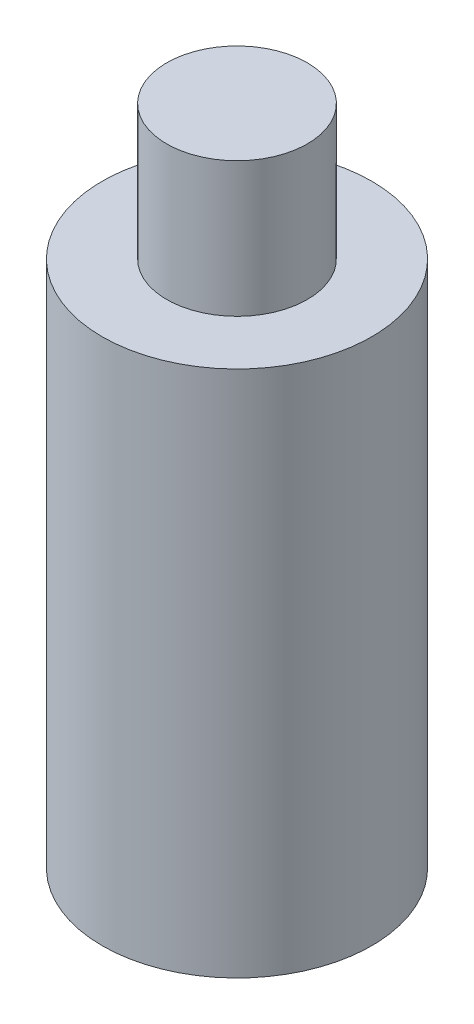
ISO-10303-21;
HEADER;
FILE_DESCRIPTION(('STEP AP214'),'2;1');
FILE_NAME('part.step','',(''),(''),'','','');
FILE_SCHEMA(('AUTOMOTIVE_DESIGN { 1 0 10303 214 1 1 1 1 }'));
ENDSEC;
DATA;
#1=APPLICATION_CONTEXT('core data for automotive mechanical design processes');
#2=APPLICATION_PROTOCOL_DEFINITION('international standard','automotive_design',2000,#1);
#3=PRODUCT_CONTEXT('',#1,'mechanical');
#4=PRODUCT('Part','Part','',(#3));
#5=PRODUCT_RELATED_PRODUCT_CATEGORY('part','',(#4));
#6=PRODUCT_DEFINITION_FORMATION('','',#4);
#7=PRODUCT_DEFINITION_CONTEXT('part definition',#1,'design');
#8=PRODUCT_DEFINITION('design','',#6,#7);
#9=PRODUCT_DEFINITION_SHAPE('','',#8);
#10=(LENGTH_UNIT() NAMED_UNIT(*) SI_UNIT(.MILLI.,.METRE.));
#11=(NAMED_UNIT(*) PLANE_ANGLE_UNIT() SI_UNIT($,.RADIAN.));
#12=(NAMED_UNIT(*) SI_UNIT($,.STERADIAN.) SOLID_ANGLE_UNIT());
#13=UNCERTAINTY_MEASURE_WITH_UNIT(LENGTH_MEASURE(1.E-05),#10,'distance_accuracy_value','');
#14=(GEOMETRIC_REPRESENTATION_CONTEXT(3) GLOBAL_UNCERTAINTY_ASSIGNED_CONTEXT((#13)) GLOBAL_UNIT_ASSIGNED_CONTEXT((#10,
#11,#12)) REPRESENTATION_CONTEXT('',''));
#15=CARTESIAN_POINT('',(0.,0.,0.));
#16=DIRECTION('',(0.,0.,1.));
#17=DIRECTION('',(1.,0.,0.));
#18=AXIS2_PLACEMENT_3D('',#15,#16,#17);
#19=CARTESIAN_POINT('',(0.,29.8196,0.));
#20=DIRECTION('',(0.,-1.,0.));
#21=DIRECTION('',(0.,0.,-1.));
#22=AXIS2_PLACEMENT_3D('',#19,#20,#21);
#23=CYLINDRICAL_SURFACE('',#22,7.62);
#24=CARTESIAN_POINT('',(0.,29.8196,0.));
#25=DIRECTION('',(0.,1.,0.));
#26=DIRECTION('',(0.,0.,1.));
#27=AXIS2_PLACEMENT_3D('',#24,#25,#26);
#28=CIRCLE('',#27,7.62);
#29=CARTESIAN_POINT('',(0.,29.8196,7.62));
#30=VERTEX_POINT('',#29);
#31=EDGE_CURVE('E51',#30,#30,#28,.T.);
#32=ORIENTED_EDGE('',*,*,#31,.F.);
#33=EDGE_LOOP('',(#32));
#34=FACE_BOUND('',#33,.T.);
#35=CARTESIAN_POINT('',(0.,0.,0.));
#36=DIRECTION('',(0.,1.,0.));
#37=DIRECTION('',(0.,0.,1.));
#38=AXIS2_PLACEMENT_3D('',#35,#36,#37);
#39=CIRCLE('',#38,7.62);
#40=CARTESIAN_POINT('',(0.,0.,7.62));
#41=VERTEX_POINT('',#40);
#42=EDGE_CURVE('E46',#41,#41,#39,.T.);
#43=ORIENTED_EDGE('',*,*,#42,.T.);
#44=EDGE_LOOP('',(#43));
#45=FACE_BOUND('',#44,.T.);
#46=ADVANCED_FACE('F43',(#34,#45),#23,.T.);
#47=CARTESIAN_POINT('',(0.,29.8196,0.));
#48=DIRECTION('',(0.,1.,0.));
#49=DIRECTION('',(0.,0.,1.));
#50=AXIS2_PLACEMENT_3D('',#47,#48,#49);
#51=PLANE('',#50);
#52=CARTESIAN_POINT('',(0.,29.8196,0.));
#53=DIRECTION('',(0.,1.,0.));
#54=DIRECTION('',(0.,0.,1.));
#55=AXIS2_PLACEMENT_3D('',#52,#53,#54);
#56=CIRCLE('',#55,3.975);
#57=CARTESIAN_POINT('',(0.,29.8196,-3.975));
#58=VERTEX_POINT('',#57);
#59=EDGE_CURVE('E10',#58,#58,#56,.T.);
#60=ORIENTED_EDGE('',*,*,#59,.F.);
#61=EDGE_LOOP('',(#60));
#62=FACE_BOUND('',#61,.T.);
#63=ORIENTED_EDGE('',*,*,#31,.T.);
#64=EDGE_LOOP('',(#63));
#65=FACE_BOUND('',#64,.T.);
#66=ADVANCED_FACE('F92',(#62,#65),#51,.T.);
#67=CARTESIAN_POINT('',(0.,0.,0.));
#68=DIRECTION('',(0.,1.,0.));
#69=DIRECTION('',(0.,0.,1.));
#70=AXIS2_PLACEMENT_3D('',#67,#68,#69);
#71=PLANE('',#70);
#72=CARTESIAN_POINT('',(-5.08,0.,0.));
#73=DIRECTION('',(0.,-1.,0.));
#74=DIRECTION('',(0.,0.,-1.));
#75=AXIS2_PLACEMENT_3D('',#72,#73,#74);
#76=CIRCLE('',#75,1.1938);
#77=CARTESIAN_POINT('',(-5.08,0.,-1.1938));
#78=VERTEX_POINT('',#77);
#79=EDGE_CURVE('E71',#78,#78,#76,.T.);
#80=ORIENTED_EDGE('',*,*,#79,.F.);
#81=EDGE_LOOP('',(#80));
#82=FACE_BOUND('',#81,.T.);
#83=CARTESIAN_POINT('',(5.08,0.,0.));
#84=DIRECTION('',(0.,-1.,0.));
#85=DIRECTION('',(0.,0.,-1.));
#86=AXIS2_PLACEMENT_3D('',#83,#84,#85);
#87=CIRCLE('',#86,1.1938);
#88=CARTESIAN_POINT('',(5.08,0.,-1.1938));
#89=VERTEX_POINT('',#88);
#90=EDGE_CURVE('E67',#89,#89,#87,.T.);
#91=ORIENTED_EDGE('',*,*,#90,.F.);
#92=EDGE_LOOP('',(#91));
#93=FACE_BOUND('',#92,.T.);
#94=ORIENTED_EDGE('',*,*,#42,.F.);
#95=EDGE_LOOP('',(#94));
#96=FACE_BOUND('',#95,.T.);
#97=ADVANCED_FACE('F88',(#82,#93,#96),#71,.F.);
#98=CARTESIAN_POINT('',(0.,37.4396,0.));
#99=DIRECTION('',(0.,-1.,0.));
#100=DIRECTION('',(0.,0.,-1.));
#101=AXIS2_PLACEMENT_3D('',#98,#99,#100);
#102=CYLINDRICAL_SURFACE('',#101,3.975);
#103=CARTESIAN_POINT('',(0.,37.4396,0.));
#104=DIRECTION('',(0.,1.,0.));
#105=DIRECTION('',(0.,0.,1.));
#106=AXIS2_PLACEMENT_3D('',#103,#104,#105);
#107=CIRCLE('',#106,3.975);
#108=CARTESIAN_POINT('',(0.,37.4396,-3.975));
#109=VERTEX_POINT('',#108);
#110=EDGE_CURVE('E58',#109,#109,#107,.T.);
#111=CARTESIAN_POINT('',(0.,37.4396,-3.975));
#112=CARTESIAN_POINT('',(0.,37.360225,-3.975));
#113=CARTESIAN_POINT('',(0.,37.28085,-3.975));
#114=CARTESIAN_POINT('',(0.,37.1221,-3.975));
#115=CARTESIAN_POINT('',(0.,37.042725,-3.975));
#116=CARTESIAN_POINT('',(0.,36.883975,-3.975));
#117=CARTESIAN_POINT('',(0.,36.8046,-3.975));
#118=CARTESIAN_POINT('',(0.,36.64585,-3.975));
#119=CARTESIAN_POINT('',(0.,36.566475,-3.975));
#120=CARTESIAN_POINT('',(0.,36.407725,-3.975));
#121=CARTESIAN_POINT('',(0.,36.32835,-3.975));
#122=CARTESIAN_POINT('',(0.,36.1696,-3.975));
#123=CARTESIAN_POINT('',(0.,36.090225,-3.975));
#124=CARTESIAN_POINT('',(0.,35.931475,-3.975));
#125=CARTESIAN_POINT('',(0.,35.8521,-3.975));
#126=CARTESIAN_POINT('',(0.,35.69335,-3.975));
#127=CARTESIAN_POINT('',(0.,35.613975,-3.975));
#128=CARTESIAN_POINT('',(0.,35.455225,-3.975));
#129=CARTESIAN_POINT('',(0.,35.37585,-3.975));
#130=CARTESIAN_POINT('',(0.,35.2171,-3.975));
#131=CARTESIAN_POINT('',(0.,35.137725,-3.975));
#132=CARTESIAN_POINT('',(0.,34.978975,-3.975));
#133=CARTESIAN_POINT('',(0.,34.8996,-3.975));
#134=CARTESIAN_POINT('',(0.,34.74085,-3.975));
#135=CARTESIAN_POINT('',(0.,34.661475,-3.975));
#136=CARTESIAN_POINT('',(0.,34.502725,-3.975));
#137=CARTESIAN_POINT('',(0.,34.42335,-3.975));
#138=CARTESIAN_POINT('',(0.,34.2646,-3.975));
#139=CARTESIAN_POINT('',(0.,34.185225,-3.975));
#140=CARTESIAN_POINT('',(0.,34.026475,-3.975));
#141=CARTESIAN_POINT('',(0.,33.9471,-3.975));
#142=CARTESIAN_POINT('',(0.,33.78835,-3.975));
#143=CARTESIAN_POINT('',(0.,33.708975,-3.975));
#144=CARTESIAN_POINT('',(0.,33.550225,-3.975));
#145=CARTESIAN_POINT('',(0.,33.47085,-3.975));
#146=CARTESIAN_POINT('',(0.,33.3121,-3.975));
#147=CARTESIAN_POINT('',(0.,33.232725,-3.975));
#148=CARTESIAN_POINT('',(0.,33.073975,-3.975));
#149=CARTESIAN_POINT('',(0.,32.9946,-3.975));
#150=CARTESIAN_POINT('',(0.,32.83585,-3.975));
#151=CARTESIAN_POINT('',(0.,32.756475,-3.975));
#152=CARTESIAN_POINT('',(0.,32.597725,-3.975));
#153=CARTESIAN_POINT('',(0.,32.51835,-3.975));
#154=CARTESIAN_POINT('',(0.,32.3596,-3.975));
#155=CARTESIAN_POINT('',(0.,32.280225,-3.975));
#156=CARTESIAN_POINT('',(0.,32.121475,-3.975));
#157=CARTESIAN_POINT('',(0.,32.0421,-3.975));
#158=CARTESIAN_POINT('',(0.,31.88335,-3.975));
#159=CARTESIAN_POINT('',(0.,31.803975,-3.975));
#160=CARTESIAN_POINT('',(0.,31.645225,-3.975));
#161=CARTESIAN_POINT('',(0.,31.56585,-3.975));
#162=CARTESIAN_POINT('',(0.,31.4071,-3.975));
#163=CARTESIAN_POINT('',(0.,31.327725,-3.975));
#164=CARTESIAN_POINT('',(0.,31.168975,-3.975));
#165=CARTESIAN_POINT('',(0.,31.0896,-3.975));
#166=CARTESIAN_POINT('',(0.,30.93085,-3.975));
#167=CARTESIAN_POINT('',(0.,30.851475,-3.975));
#168=CARTESIAN_POINT('',(0.,30.692725,-3.975));
#169=CARTESIAN_POINT('',(0.,30.61335,-3.975));
#170=CARTESIAN_POINT('',(0.,30.4546,-3.975));
#171=CARTESIAN_POINT('',(0.,30.375225,-3.975));
#172=CARTESIAN_POINT('',(0.,30.216475,-3.975));
#173=CARTESIAN_POINT('',(0.,30.1371,-3.975));
#174=CARTESIAN_POINT('',(0.,29.97835,-3.975));
#175=CARTESIAN_POINT('',(0.,29.898975,-3.975));
#176=CARTESIAN_POINT('',(0.,29.8196,-3.975));
#177=B_SPLINE_CURVE_WITH_KNOTS('',3,(#111,#112,#113,#114,#115,#116,#117,#118,#119,#120,#121,
#122,#123,#124,#125,#126,#127,#128,#129,#130,#131,#132,#133,#134,#135,#136,#137,#138,#139,#140,
#141,#142,#143,#144,#145,#146,#147,#148,#149,#150,#151,#152,#153,#154,#155,#156,#157,#158,#159,
#160,#161,#162,#163,#164,#165,#166,#167,#168,#169,#170,#171,#172,#173,#174,#175,#176),
.UNSPECIFIED.,.F.,.F.,(4,2,2,2,2,2,2,2,2,2,2,2,2,2,2,2,2,2,2,2,2,2,2,2,2,2,2,2,2,2,2,2,4),(0.,
0.238124999999999,0.476249999999998,0.714374999999996,0.952499999999995,1.19062499999999,
1.42874999999999,1.666875,1.905,2.143125,2.38124999999999,2.61937499999999,2.85749999999999,
3.095625,3.33375,3.571875,3.80999999999999,4.04812499999999,4.28624999999999,4.524375,4.7625,
5.00062499999999,5.23874999999999,5.47687499999999,5.71499999999999,5.95312499999999,
6.19124999999999,6.42937499999999,6.66749999999999,6.90562499999999,7.14374999999999,
7.38187499999999,7.61999999999999),.UNSPECIFIED.);
#178=EDGE_CURVE('BSEAM91',#109,#58,#177,.T.);
#179=ORIENTED_EDGE('',*,*,#110,.F.);
#180=ORIENTED_EDGE('',*,*,#59,.T.);
#181=ORIENTED_EDGE('',*,*,#178,.T.);
#182=ORIENTED_EDGE('',*,*,#178,.F.);
#183=EDGE_LOOP('',(#179,#181,#180,#182));
#184=FACE_BOUND('',#183,.T.);
#185=ADVANCED_FACE('F91',(#184),#102,.T.);
#186=CARTESIAN_POINT('',(0.,37.4396,0.));
#187=DIRECTION('',(0.,1.,0.));
#188=DIRECTION('',(0.,0.,1.));
#189=AXIS2_PLACEMENT_3D('',#186,#187,#188);
#190=PLANE('',#189);
#191=ORIENTED_EDGE('',*,*,#110,.T.);
#192=EDGE_LOOP('',(#191));
#193=FACE_BOUND('',#192,.T.);
#194=ADVANCED_FACE('F113',(#193),#190,.T.);
#195=CARTESIAN_POINT('',(5.08,7.8232,0.));
#196=DIRECTION('',(0.,-1.,0.));
#197=DIRECTION('',(0.,0.,-1.));
#198=AXIS2_PLACEMENT_3D('',#195,#196,#197);
#199=CYLINDRICAL_SURFACE('',#198,1.1938);
#200=CARTESIAN_POINT('',(5.08,7.8232,0.));
#201=DIRECTION('',(0.,-1.,0.));
#202=DIRECTION('',(0.,0.,-1.));
#203=AXIS2_PLACEMENT_3D('',#200,#201,#202);
#204=CIRCLE('',#203,1.1938);
#205=CARTESIAN_POINT('',(5.08,7.8232,-1.1938));
#206=VERTEX_POINT('',#205);
#207=EDGE_CURVE('E63',#206,#206,#204,.T.);
#208=ORIENTED_EDGE('',*,*,#207,.F.);
#209=EDGE_LOOP('',(#208));
#210=FACE_BOUND('',#209,.T.);
#211=ORIENTED_EDGE('',*,*,#90,.T.);
#212=EDGE_LOOP('',(#211));
#213=FACE_BOUND('',#212,.T.);
#214=ADVANCED_FACE('F117',(#210,#213),#199,.F.);
#215=CARTESIAN_POINT('',(5.08,7.8232,0.));
#216=DIRECTION('',(0.,-1.,0.));
#217=DIRECTION('',(0.,0.,-1.));
#218=AXIS2_PLACEMENT_3D('',#215,#216,#217);
#219=PLANE('',#218);
#220=ORIENTED_EDGE('',*,*,#207,.T.);
#221=EDGE_LOOP('',(#220));
#222=FACE_BOUND('',#221,.T.);
#223=ADVANCED_FACE('F84',(#222),#219,.T.);
#224=CARTESIAN_POINT('',(-5.08,7.8232,0.));
#225=DIRECTION('',(0.,-1.,0.));
#226=DIRECTION('',(0.,0.,-1.));
#227=AXIS2_PLACEMENT_3D('',#224,#225,#226);
#228=CYLINDRICAL_SURFACE('',#227,1.1938);
#229=CARTESIAN_POINT('',(-5.08,7.8232,0.));
#230=DIRECTION('',(0.,-1.,0.));
#231=DIRECTION('',(0.,0.,-1.));
#232=AXIS2_PLACEMENT_3D('',#229,#230,#231);
#233=CIRCLE('',#232,1.1938);
#234=CARTESIAN_POINT('',(-5.08,7.8232,-1.1938));
#235=VERTEX_POINT('',#234);
#236=EDGE_CURVE('E62',#235,#235,#233,.T.);
#237=ORIENTED_EDGE('',*,*,#236,.F.);
#238=EDGE_LOOP('',(#237));
#239=FACE_BOUND('',#238,.T.);
#240=ORIENTED_EDGE('',*,*,#79,.T.);
#241=EDGE_LOOP('',(#240));
#242=FACE_BOUND('',#241,.T.);
#243=ADVANCED_FACE('F81',(#239,#242),#228,.F.);
#244=CARTESIAN_POINT('',(-5.08,7.8232,0.));
#245=DIRECTION('',(0.,-1.,0.));
#246=DIRECTION('',(0.,0.,-1.));
#247=AXIS2_PLACEMENT_3D('',#244,#245,#246);
#248=PLANE('',#247);
#249=ORIENTED_EDGE('',*,*,#236,.T.);
#250=EDGE_LOOP('',(#249));
#251=FACE_BOUND('',#250,.T.);
#252=ADVANCED_FACE('F79',(#251),#248,.T.);
#253=CLOSED_SHELL('',(#46,#66,#97,#185,#194,#214,#223,#243,#252));
#254=MANIFOLD_SOLID_BREP('B2',#253);
#255=ADVANCED_BREP_SHAPE_REPRESENTATION('',(#18,#254),#14);
#256=SHAPE_DEFINITION_REPRESENTATION(#9,#255);
ENDSEC;
END-ISO-10303-21;
